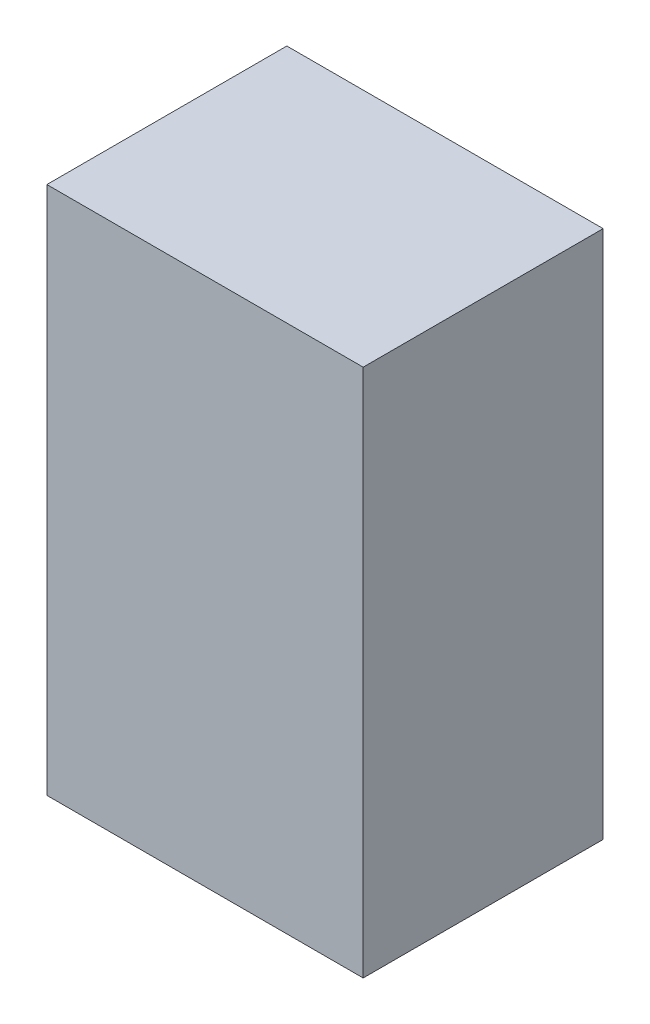
ISO-10303-21;
HEADER;
FILE_DESCRIPTION(('STEP AP214'),'2;1');
FILE_NAME('part.step','',(''),(''),'','','');
FILE_SCHEMA(('AUTOMOTIVE_DESIGN { 1 0 10303 214 1 1 1 1 }'));
ENDSEC;
DATA;
#1=APPLICATION_CONTEXT('core data for automotive mechanical design processes');
#2=APPLICATION_PROTOCOL_DEFINITION('international standard','automotive_design',2000,#1);
#3=PRODUCT_CONTEXT('',#1,'mechanical');
#4=PRODUCT('Part','Part','',(#3));
#5=PRODUCT_RELATED_PRODUCT_CATEGORY('part','',(#4));
#6=PRODUCT_DEFINITION_FORMATION('','',#4);
#7=PRODUCT_DEFINITION_CONTEXT('part definition',#1,'design');
#8=PRODUCT_DEFINITION('design','',#6,#7);
#9=PRODUCT_DEFINITION_SHAPE('','',#8);
#10=(LENGTH_UNIT() NAMED_UNIT(*) SI_UNIT(.MILLI.,.METRE.));
#11=(NAMED_UNIT(*) PLANE_ANGLE_UNIT() SI_UNIT($,.RADIAN.));
#12=(NAMED_UNIT(*) SI_UNIT($,.STERADIAN.) SOLID_ANGLE_UNIT());
#13=UNCERTAINTY_MEASURE_WITH_UNIT(LENGTH_MEASURE(1.E-05),#10,'distance_accuracy_value','');
#14=(GEOMETRIC_REPRESENTATION_CONTEXT(3) GLOBAL_UNCERTAINTY_ASSIGNED_CONTEXT((#13)) GLOBAL_UNIT_ASSIGNED_CONTEXT((#10,
#11,#12)) REPRESENTATION_CONTEXT('',''));
#15=CARTESIAN_POINT('',(0.,0.,0.));
#16=DIRECTION('',(0.,0.,1.));
#17=DIRECTION('',(1.,0.,0.));
#18=AXIS2_PLACEMENT_3D('',#15,#16,#17);
#19=CARTESIAN_POINT('',(-29.,97.,-22.));
#20=DIRECTION('',(1.,0.,0.));
#21=DIRECTION('',(0.,0.,-1.));
#22=AXIS2_PLACEMENT_3D('',#19,#20,#21);
#23=PLANE('',#22);
#24=DIRECTION('',(0.,0.,1.));
#25=VECTOR('',#24,1.);
#26=CARTESIAN_POINT('',(-29.,0.,-22.));
#27=LINE('',#26,#25);
#28=CARTESIAN_POINT('',(-29.,0.,-22.));
#29=VERTEX_POINT('',#28);
#30=CARTESIAN_POINT('',(-29.,0.,22.));
#31=VERTEX_POINT('',#30);
#32=EDGE_CURVE('E96',#29,#31,#27,.T.);
#33=ORIENTED_EDGE('',*,*,#32,.T.);
#34=DIRECTION('',(0.,-1.,0.));
#35=VECTOR('',#34,1.);
#36=CARTESIAN_POINT('',(-29.,97.,22.));
#37=LINE('',#36,#35);
#38=CARTESIAN_POINT('',(-29.,97.,22.));
#39=VERTEX_POINT('',#38);
#40=EDGE_CURVE('E11',#39,#31,#37,.T.);
#41=ORIENTED_EDGE('',*,*,#40,.F.);
#42=DIRECTION('',(0.,0.,1.));
#43=VECTOR('',#42,1.);
#44=CARTESIAN_POINT('',(-29.,97.,-22.));
#45=LINE('',#44,#43);
#46=CARTESIAN_POINT('',(-29.,97.,-22.));
#47=VERTEX_POINT('',#46);
#48=EDGE_CURVE('E84',#47,#39,#45,.T.);
#49=ORIENTED_EDGE('',*,*,#48,.F.);
#50=DIRECTION('',(0.,-1.,0.));
#51=VECTOR('',#50,1.);
#52=CARTESIAN_POINT('',(-29.,97.,-22.));
#53=LINE('',#52,#51);
#54=EDGE_CURVE('E92',#47,#29,#53,.T.);
#55=ORIENTED_EDGE('',*,*,#54,.T.);
#56=EDGE_LOOP('',(#33,#41,#49,#55));
#57=FACE_BOUND('',#56,.T.);
#58=ADVANCED_FACE('F33',(#57),#23,.F.);
#59=CARTESIAN_POINT('',(29.,97.,22.));
#60=DIRECTION('',(0.,0.,-1.));
#61=DIRECTION('',(-1.,0.,0.));
#62=AXIS2_PLACEMENT_3D('',#59,#60,#61);
#63=PLANE('',#62);
#64=DIRECTION('',(1.,0.,0.));
#65=VECTOR('',#64,1.);
#66=CARTESIAN_POINT('',(29.,0.,22.));
#67=LINE('',#66,#65);
#68=CARTESIAN_POINT('',(29.,0.,22.));
#69=VERTEX_POINT('',#68);
#70=EDGE_CURVE('E88',#31,#69,#67,.T.);
#71=ORIENTED_EDGE('',*,*,#70,.T.);
#72=DIRECTION('',(0.,-1.,0.));
#73=VECTOR('',#72,1.);
#74=CARTESIAN_POINT('',(29.,97.,22.));
#75=LINE('',#74,#73);
#76=CARTESIAN_POINT('',(29.,97.,22.));
#77=VERTEX_POINT('',#76);
#78=EDGE_CURVE('E41',#77,#69,#75,.T.);
#79=ORIENTED_EDGE('',*,*,#78,.F.);
#80=DIRECTION('',(1.,0.,0.));
#81=VECTOR('',#80,1.);
#82=CARTESIAN_POINT('',(29.,97.,22.));
#83=LINE('',#82,#81);
#84=EDGE_CURVE('E79',#39,#77,#83,.T.);
#85=ORIENTED_EDGE('',*,*,#84,.F.);
#86=ORIENTED_EDGE('',*,*,#40,.T.);
#87=EDGE_LOOP('',(#71,#79,#85,#86));
#88=FACE_BOUND('',#87,.T.);
#89=ADVANCED_FACE('F87',(#88),#63,.F.);
#90=CARTESIAN_POINT('',(29.,97.,-22.));
#91=DIRECTION('',(-1.,0.,0.));
#92=DIRECTION('',(0.,0.,1.));
#93=AXIS2_PLACEMENT_3D('',#90,#91,#92);
#94=PLANE('',#93);
#95=DIRECTION('',(0.,0.,-1.));
#96=VECTOR('',#95,1.);
#97=CARTESIAN_POINT('',(29.,0.,-22.));
#98=LINE('',#97,#96);
#99=CARTESIAN_POINT('',(29.,0.,-22.));
#100=VERTEX_POINT('',#99);
#101=EDGE_CURVE('E66',#69,#100,#98,.T.);
#102=ORIENTED_EDGE('',*,*,#101,.T.);
#103=DIRECTION('',(0.,-1.,0.));
#104=VECTOR('',#103,1.);
#105=CARTESIAN_POINT('',(29.,97.,-22.));
#106=LINE('',#105,#104);
#107=CARTESIAN_POINT('',(29.,97.,-22.));
#108=VERTEX_POINT('',#107);
#109=EDGE_CURVE('E89',#108,#100,#106,.T.);
#110=ORIENTED_EDGE('',*,*,#109,.F.);
#111=DIRECTION('',(0.,0.,-1.));
#112=VECTOR('',#111,1.);
#113=CARTESIAN_POINT('',(29.,97.,-22.));
#114=LINE('',#113,#112);
#115=EDGE_CURVE('E82',#77,#108,#114,.T.);
#116=ORIENTED_EDGE('',*,*,#115,.F.);
#117=ORIENTED_EDGE('',*,*,#78,.T.);
#118=EDGE_LOOP('',(#102,#110,#116,#117));
#119=FACE_BOUND('',#118,.T.);
#120=ADVANCED_FACE('F90',(#119),#94,.F.);
#121=CARTESIAN_POINT('',(29.,97.,-22.));
#122=DIRECTION('',(0.,0.,1.));
#123=DIRECTION('',(1.,0.,0.));
#124=AXIS2_PLACEMENT_3D('',#121,#122,#123);
#125=PLANE('',#124);
#126=DIRECTION('',(-1.,0.,0.));
#127=VECTOR('',#126,1.);
#128=CARTESIAN_POINT('',(29.,0.,-22.));
#129=LINE('',#128,#127);
#130=EDGE_CURVE('E72',#100,#29,#129,.T.);
#131=ORIENTED_EDGE('',*,*,#130,.T.);
#132=ORIENTED_EDGE('',*,*,#54,.F.);
#133=DIRECTION('',(-1.,0.,0.));
#134=VECTOR('',#133,1.);
#135=CARTESIAN_POINT('',(29.,97.,-22.));
#136=LINE('',#135,#134);
#137=EDGE_CURVE('E49',#108,#47,#136,.T.);
#138=ORIENTED_EDGE('',*,*,#137,.F.);
#139=ORIENTED_EDGE('',*,*,#109,.T.);
#140=EDGE_LOOP('',(#131,#132,#138,#139));
#141=FACE_BOUND('',#140,.T.);
#142=ADVANCED_FACE('F103',(#141),#125,.F.);
#143=CARTESIAN_POINT('',(0.,97.,0.));
#144=DIRECTION('',(0.,-1.,0.));
#145=DIRECTION('',(0.,0.,-1.));
#146=AXIS2_PLACEMENT_3D('',#143,#144,#145);
#147=PLANE('',#146);
#148=ORIENTED_EDGE('',*,*,#48,.T.);
#149=ORIENTED_EDGE('',*,*,#84,.T.);
#150=ORIENTED_EDGE('',*,*,#115,.T.);
#151=ORIENTED_EDGE('',*,*,#137,.T.);
#152=EDGE_LOOP('',(#148,#149,#150,#151));
#153=FACE_BOUND('',#152,.T.);
#154=ADVANCED_FACE('F80',(#153),#147,.F.);
#155=CARTESIAN_POINT('',(0.,0.,0.));
#156=DIRECTION('',(0.,-1.,0.));
#157=DIRECTION('',(0.,0.,-1.));
#158=AXIS2_PLACEMENT_3D('',#155,#156,#157);
#159=PLANE('',#158);
#160=ORIENTED_EDGE('',*,*,#32,.F.);
#161=ORIENTED_EDGE('',*,*,#130,.F.);
#162=ORIENTED_EDGE('',*,*,#101,.F.);
#163=ORIENTED_EDGE('',*,*,#70,.F.);
#164=EDGE_LOOP('',(#160,#161,#162,#163));
#165=FACE_BOUND('',#164,.T.);
#166=ADVANCED_FACE('F106',(#165),#159,.T.);
#167=CLOSED_SHELL('',(#58,#89,#120,#142,#154,#166));
#168=MANIFOLD_SOLID_BREP('B2',#167);
#169=ADVANCED_BREP_SHAPE_REPRESENTATION('',(#18,#168),#14);
#170=SHAPE_DEFINITION_REPRESENTATION(#9,#169);
ENDSEC;
END-ISO-10303-21;
